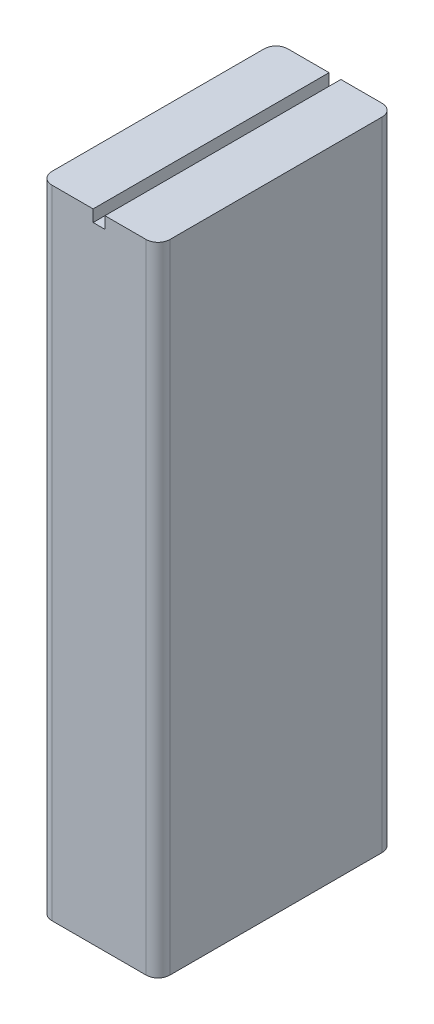
ISO-10303-21;
HEADER;
FILE_DESCRIPTION(('STEP AP214'),'2;1');
FILE_NAME('part.step','',(''),(''),'','','');
FILE_SCHEMA(('AUTOMOTIVE_DESIGN { 1 0 10303 214 1 1 1 1 }'));
ENDSEC;
DATA;
#1=APPLICATION_CONTEXT('core data for automotive mechanical design processes');
#2=APPLICATION_PROTOCOL_DEFINITION('international standard','automotive_design',2000,#1);
#3=PRODUCT_CONTEXT('',#1,'mechanical');
#4=PRODUCT('Part','Part','',(#3));
#5=PRODUCT_RELATED_PRODUCT_CATEGORY('part','',(#4));
#6=PRODUCT_DEFINITION_FORMATION('','',#4);
#7=PRODUCT_DEFINITION_CONTEXT('part definition',#1,'design');
#8=PRODUCT_DEFINITION('design','',#6,#7);
#9=PRODUCT_DEFINITION_SHAPE('','',#8);
#10=(LENGTH_UNIT() NAMED_UNIT(*) SI_UNIT(.MILLI.,.METRE.));
#11=(NAMED_UNIT(*) PLANE_ANGLE_UNIT() SI_UNIT($,.RADIAN.));
#12=(NAMED_UNIT(*) SI_UNIT($,.STERADIAN.) SOLID_ANGLE_UNIT());
#13=UNCERTAINTY_MEASURE_WITH_UNIT(LENGTH_MEASURE(1.E-05),#10,'distance_accuracy_value','');
#14=(GEOMETRIC_REPRESENTATION_CONTEXT(3) GLOBAL_UNCERTAINTY_ASSIGNED_CONTEXT((#13)) GLOBAL_UNIT_ASSIGNED_CONTEXT((#10,
#11,#12)) REPRESENTATION_CONTEXT('',''));
#15=CARTESIAN_POINT('',(0.,0.,0.));
#16=DIRECTION('',(0.,0.,1.));
#17=DIRECTION('',(1.,0.,0.));
#18=AXIS2_PLACEMENT_3D('',#15,#16,#17);
#19=CARTESIAN_POINT('',(0.,54.,0.));
#20=DIRECTION('',(0.,-1.,0.));
#21=DIRECTION('',(0.,0.,-1.));
#22=AXIS2_PLACEMENT_3D('',#19,#20,#21);
#23=PLANE('',#22);
#24=DIRECTION('',(1.,0.,0.));
#25=VECTOR('',#24,1.);
#26=CARTESIAN_POINT('',(0.,54.,0.));
#27=LINE('',#26,#25);
#28=CARTESIAN_POINT('',(0.999999999999999,54.,0.));
#29=VERTEX_POINT('',#28);
#30=CARTESIAN_POINT('',(4.5,54.,0.));
#31=VERTEX_POINT('',#30);
#32=EDGE_CURVE('E170',#29,#31,#27,.T.);
#33=ORIENTED_EDGE('',*,*,#32,.T.);
#34=DIRECTION('',(0.,0.,1.));
#35=VECTOR('',#34,1.);
#36=CARTESIAN_POINT('',(4.5,54.,-20.));
#37=LINE('',#36,#35);
#38=CARTESIAN_POINT('',(4.5,54.,-20.));
#39=VERTEX_POINT('',#38);
#40=EDGE_CURVE('E133',#39,#31,#37,.T.);
#41=ORIENTED_EDGE('',*,*,#40,.F.);
#42=DIRECTION('',(-1.,0.,0.));
#43=VECTOR('',#42,1.);
#44=CARTESIAN_POINT('',(0.,54.,-20.));
#45=LINE('',#44,#43);
#46=CARTESIAN_POINT('',(0.999999999999997,54.,-20.));
#47=VERTEX_POINT('',#46);
#48=EDGE_CURVE('E62',#39,#47,#45,.T.);
#49=ORIENTED_EDGE('',*,*,#48,.T.);
#50=CARTESIAN_POINT('',(0.999999999999997,54.,-19.));
#51=DIRECTION('',(0.,-1.,0.));
#52=DIRECTION('',(0.,0.,-1.));
#53=AXIS2_PLACEMENT_3D('',#50,#51,#52);
#54=CIRCLE('',#53,1.);
#55=CARTESIAN_POINT('',(0.,54.,-19.));
#56=VERTEX_POINT('',#55);
#57=EDGE_CURVE('E207',#47,#56,#54,.F.);
#58=ORIENTED_EDGE('',*,*,#57,.T.);
#59=DIRECTION('',(0.,0.,1.));
#60=VECTOR('',#59,1.);
#61=CARTESIAN_POINT('',(0.,54.,0.));
#62=LINE('',#61,#60);
#63=CARTESIAN_POINT('',(0.,54.,-1.));
#64=VERTEX_POINT('',#63);
#65=EDGE_CURVE('E165',#56,#64,#62,.T.);
#66=ORIENTED_EDGE('',*,*,#65,.T.);
#67=CARTESIAN_POINT('',(1.,54.,-1.));
#68=DIRECTION('',(0.,-1.,0.));
#69=DIRECTION('',(0.,0.,-1.));
#70=AXIS2_PLACEMENT_3D('',#67,#68,#69);
#71=CIRCLE('',#70,1.);
#72=EDGE_CURVE('E211',#64,#29,#71,.F.);
#73=ORIENTED_EDGE('',*,*,#72,.T.);
#74=EDGE_LOOP('',(#33,#41,#49,#58,#66,#73));
#75=FACE_BOUND('',#74,.T.);
#76=ADVANCED_FACE('F39',(#75),#23,.F.);
#77=CARTESIAN_POINT('',(0.,54.,0.));
#78=DIRECTION('',(1.,0.,0.));
#79=DIRECTION('',(0.,0.,-1.));
#80=AXIS2_PLACEMENT_3D('',#77,#78,#79);
#81=PLANE('',#80);
#82=DIRECTION('',(0.,0.,1.));
#83=VECTOR('',#82,1.);
#84=CARTESIAN_POINT('',(0.,0.,0.));
#85=LINE('',#84,#83);
#86=CARTESIAN_POINT('',(0.,0.,-19.));
#87=VERTEX_POINT('',#86);
#88=CARTESIAN_POINT('',(0.,0.,-1.));
#89=VERTEX_POINT('',#88);
#90=EDGE_CURVE('E160',#87,#89,#85,.T.);
#91=ORIENTED_EDGE('',*,*,#90,.T.);
#92=DIRECTION('',(0.,-1.,0.));
#93=VECTOR('',#92,1.);
#94=CARTESIAN_POINT('',(0.,54.,-1.));
#95=LINE('',#94,#93);
#96=EDGE_CURVE('E218',#89,#64,#95,.F.);
#97=ORIENTED_EDGE('',*,*,#96,.T.);
#98=ORIENTED_EDGE('',*,*,#65,.F.);
#99=DIRECTION('',(0.,-1.,0.));
#100=VECTOR('',#99,1.);
#101=CARTESIAN_POINT('',(0.,54.,-19.));
#102=LINE('',#101,#100);
#103=EDGE_CURVE('E215',#56,#87,#102,.T.);
#104=ORIENTED_EDGE('',*,*,#103,.T.);
#105=EDGE_LOOP('',(#91,#97,#98,#104));
#106=FACE_BOUND('',#105,.T.);
#107=ADVANCED_FACE('F229',(#106),#81,.F.);
#108=CARTESIAN_POINT('',(0.,54.,0.));
#109=DIRECTION('',(0.,0.,-1.));
#110=DIRECTION('',(-1.,0.,0.));
#111=AXIS2_PLACEMENT_3D('',#108,#109,#110);
#112=PLANE('',#111);
#113=DIRECTION('',(1.,0.,0.));
#114=VECTOR('',#113,1.);
#115=CARTESIAN_POINT('',(4.5,53.,0.));
#116=LINE('',#115,#114);
#117=CARTESIAN_POINT('',(4.5,53.,0.));
#118=VERTEX_POINT('',#117);
#119=CARTESIAN_POINT('',(5.5,53.,0.));
#120=VERTEX_POINT('',#119);
#121=EDGE_CURVE('E144',#118,#120,#116,.T.);
#122=ORIENTED_EDGE('',*,*,#121,.F.);
#123=DIRECTION('',(0.,1.,0.));
#124=VECTOR('',#123,1.);
#125=CARTESIAN_POINT('',(4.5,53.,0.));
#126=LINE('',#125,#124);
#127=EDGE_CURVE('E128',#118,#31,#126,.T.);
#128=ORIENTED_EDGE('',*,*,#127,.T.);
#129=ORIENTED_EDGE('',*,*,#32,.F.);
#130=DIRECTION('',(0.,-1.,0.));
#131=VECTOR('',#130,1.);
#132=CARTESIAN_POINT('',(1.,54.,0.));
#133=LINE('',#132,#131);
#134=CARTESIAN_POINT('',(0.999999999999999,0.,0.));
#135=VERTEX_POINT('',#134);
#136=EDGE_CURVE('E201',#29,#135,#133,.T.);
#137=ORIENTED_EDGE('',*,*,#136,.T.);
#138=DIRECTION('',(1.,0.,0.));
#139=VECTOR('',#138,1.);
#140=CARTESIAN_POINT('',(0.,0.,0.));
#141=LINE('',#140,#139);
#142=CARTESIAN_POINT('',(9.,0.,0.));
#143=VERTEX_POINT('',#142);
#144=EDGE_CURVE('E181',#135,#143,#141,.T.);
#145=ORIENTED_EDGE('',*,*,#144,.T.);
#146=DIRECTION('',(0.,-1.,0.));
#147=VECTOR('',#146,1.);
#148=CARTESIAN_POINT('',(9.00000000000001,54.,0.));
#149=LINE('',#148,#147);
#150=CARTESIAN_POINT('',(9.,54.,0.));
#151=VERTEX_POINT('',#150);
#152=EDGE_CURVE('E204',#143,#151,#149,.F.);
#153=ORIENTED_EDGE('',*,*,#152,.T.);
#154=CARTESIAN_POINT('',(5.5,54.,0.));
#155=VERTEX_POINT('',#154);
#156=EDGE_CURVE('E168',#155,#151,#27,.T.);
#157=ORIENTED_EDGE('',*,*,#156,.F.);
#158=DIRECTION('',(0.,1.,0.));
#159=VECTOR('',#158,1.);
#160=CARTESIAN_POINT('',(5.5,53.,0.));
#161=LINE('',#160,#159);
#162=EDGE_CURVE('E54',#120,#155,#161,.T.);
#163=ORIENTED_EDGE('',*,*,#162,.F.);
#164=EDGE_LOOP('',(#122,#128,#129,#137,#145,#153,#157,#163));
#165=FACE_BOUND('',#164,.T.);
#166=ADVANCED_FACE('F149',(#165),#112,.F.);
#167=CARTESIAN_POINT('',(10.,54.,0.));
#168=DIRECTION('',(-1.,0.,0.));
#169=DIRECTION('',(0.,0.,1.));
#170=AXIS2_PLACEMENT_3D('',#167,#168,#169);
#171=PLANE('',#170);
#172=DIRECTION('',(0.,0.,-1.));
#173=VECTOR('',#172,1.);
#174=CARTESIAN_POINT('',(10.,54.,0.));
#175=LINE('',#174,#173);
#176=CARTESIAN_POINT('',(10.,54.,-1.));
#177=VERTEX_POINT('',#176);
#178=CARTESIAN_POINT('',(10.,54.,-19.));
#179=VERTEX_POINT('',#178);
#180=EDGE_CURVE('E172',#177,#179,#175,.T.);
#181=ORIENTED_EDGE('',*,*,#180,.F.);
#182=DIRECTION('',(0.,-1.,0.));
#183=VECTOR('',#182,1.);
#184=CARTESIAN_POINT('',(10.,54.,-1.));
#185=LINE('',#184,#183);
#186=CARTESIAN_POINT('',(10.,0.,-1.));
#187=VERTEX_POINT('',#186);
#188=EDGE_CURVE('E190',#177,#187,#185,.T.);
#189=ORIENTED_EDGE('',*,*,#188,.T.);
#190=DIRECTION('',(0.,0.,-1.));
#191=VECTOR('',#190,1.);
#192=CARTESIAN_POINT('',(10.,0.,0.));
#193=LINE('',#192,#191);
#194=CARTESIAN_POINT('',(10.,0.,-19.));
#195=VERTEX_POINT('',#194);
#196=EDGE_CURVE('E184',#187,#195,#193,.T.);
#197=ORIENTED_EDGE('',*,*,#196,.T.);
#198=DIRECTION('',(0.,-1.,0.));
#199=VECTOR('',#198,1.);
#200=CARTESIAN_POINT('',(10.,54.,-19.));
#201=LINE('',#200,#199);
#202=EDGE_CURVE('E178',#195,#179,#201,.F.);
#203=ORIENTED_EDGE('',*,*,#202,.T.);
#204=EDGE_LOOP('',(#181,#189,#197,#203));
#205=FACE_BOUND('',#204,.T.);
#206=ADVANCED_FACE('F246',(#205),#171,.F.);
#207=CARTESIAN_POINT('',(0.,54.,-20.));
#208=DIRECTION('',(0.,0.,1.));
#209=DIRECTION('',(1.,0.,0.));
#210=AXIS2_PLACEMENT_3D('',#207,#208,#209);
#211=PLANE('',#210);
#212=ORIENTED_EDGE('',*,*,#48,.F.);
#213=DIRECTION('',(0.,1.,0.));
#214=VECTOR('',#213,1.);
#215=CARTESIAN_POINT('',(4.5,53.,-20.));
#216=LINE('',#215,#214);
#217=CARTESIAN_POINT('',(4.5,53.,-20.));
#218=VERTEX_POINT('',#217);
#219=EDGE_CURVE('E158',#218,#39,#216,.T.);
#220=ORIENTED_EDGE('',*,*,#219,.F.);
#221=DIRECTION('',(-1.,0.,0.));
#222=VECTOR('',#221,1.);
#223=CARTESIAN_POINT('',(4.5,53.,-20.));
#224=LINE('',#223,#222);
#225=CARTESIAN_POINT('',(5.5,53.,-20.));
#226=VERTEX_POINT('',#225);
#227=EDGE_CURVE('E138',#226,#218,#224,.T.);
#228=ORIENTED_EDGE('',*,*,#227,.F.);
#229=DIRECTION('',(0.,1.,0.));
#230=VECTOR('',#229,1.);
#231=CARTESIAN_POINT('',(5.5,53.,-20.));
#232=LINE('',#231,#230);
#233=CARTESIAN_POINT('',(5.5,54.,-20.));
#234=VERTEX_POINT('',#233);
#235=EDGE_CURVE('E161',#226,#234,#232,.T.);
#236=ORIENTED_EDGE('',*,*,#235,.T.);
#237=CARTESIAN_POINT('',(9.,54.,-20.));
#238=VERTEX_POINT('',#237);
#239=EDGE_CURVE('E175',#238,#234,#45,.T.);
#240=ORIENTED_EDGE('',*,*,#239,.F.);
#241=DIRECTION('',(0.,-1.,0.));
#242=VECTOR('',#241,1.);
#243=CARTESIAN_POINT('',(9.,54.,-20.));
#244=LINE('',#243,#242);
#245=CARTESIAN_POINT('',(9.,0.,-20.));
#246=VERTEX_POINT('',#245);
#247=EDGE_CURVE('E11',#238,#246,#244,.T.);
#248=ORIENTED_EDGE('',*,*,#247,.T.);
#249=DIRECTION('',(-1.,0.,0.));
#250=VECTOR('',#249,1.);
#251=CARTESIAN_POINT('',(0.,0.,-20.));
#252=LINE('',#251,#250);
#253=CARTESIAN_POINT('',(0.999999999999997,0.,-20.));
#254=VERTEX_POINT('',#253);
#255=EDGE_CURVE('E169',#246,#254,#252,.T.);
#256=ORIENTED_EDGE('',*,*,#255,.T.);
#257=DIRECTION('',(0.,-1.,0.));
#258=VECTOR('',#257,1.);
#259=CARTESIAN_POINT('',(0.999999999999997,54.,-20.));
#260=LINE('',#259,#258);
#261=EDGE_CURVE('E47',#254,#47,#260,.F.);
#262=ORIENTED_EDGE('',*,*,#261,.T.);
#263=EDGE_LOOP('',(#212,#220,#228,#236,#240,#248,#256,#262));
#264=FACE_BOUND('',#263,.T.);
#265=ADVANCED_FACE('F222',(#264),#211,.F.);
#266=ORIENTED_EDGE('',*,*,#239,.T.);
#267=DIRECTION('',(0.,0.,-1.));
#268=VECTOR('',#267,1.);
#269=CARTESIAN_POINT('',(5.5,54.,-20.));
#270=LINE('',#269,#268);
#271=EDGE_CURVE('E147',#155,#234,#270,.T.);
#272=ORIENTED_EDGE('',*,*,#271,.F.);
#273=ORIENTED_EDGE('',*,*,#156,.T.);
#274=CARTESIAN_POINT('',(9.00000000000001,54.,-1.));
#275=DIRECTION('',(0.,-1.,0.));
#276=DIRECTION('',(0.,0.,-1.));
#277=AXIS2_PLACEMENT_3D('',#274,#275,#276);
#278=CIRCLE('',#277,1.);
#279=EDGE_CURVE('E213',#151,#177,#278,.F.);
#280=ORIENTED_EDGE('',*,*,#279,.T.);
#281=ORIENTED_EDGE('',*,*,#180,.T.);
#282=CARTESIAN_POINT('',(9.,54.,-19.));
#283=DIRECTION('',(0.,-1.,0.));
#284=DIRECTION('',(0.,0.,-1.));
#285=AXIS2_PLACEMENT_3D('',#282,#283,#284);
#286=CIRCLE('',#285,1.);
#287=EDGE_CURVE('E209',#179,#238,#286,.F.);
#288=ORIENTED_EDGE('',*,*,#287,.T.);
#289=EDGE_LOOP('',(#266,#272,#273,#280,#281,#288));
#290=FACE_BOUND('',#289,.T.);
#291=ADVANCED_FACE('F250',(#290),#23,.F.);
#292=CARTESIAN_POINT('',(0.,0.,0.));
#293=DIRECTION('',(0.,-1.,0.));
#294=DIRECTION('',(0.,0.,-1.));
#295=AXIS2_PLACEMENT_3D('',#292,#293,#294);
#296=PLANE('',#295);
#297=ORIENTED_EDGE('',*,*,#196,.F.);
#298=CARTESIAN_POINT('',(9.00000000000001,0.,-1.));
#299=DIRECTION('',(0.,-1.,0.));
#300=DIRECTION('',(0.,0.,-1.));
#301=AXIS2_PLACEMENT_3D('',#298,#299,#300);
#302=CIRCLE('',#301,1.);
#303=EDGE_CURVE('E199',#187,#143,#302,.T.);
#304=ORIENTED_EDGE('',*,*,#303,.T.);
#305=ORIENTED_EDGE('',*,*,#144,.F.);
#306=CARTESIAN_POINT('',(1.,0.,-1.));
#307=DIRECTION('',(0.,-1.,0.));
#308=DIRECTION('',(0.,0.,-1.));
#309=AXIS2_PLACEMENT_3D('',#306,#307,#308);
#310=CIRCLE('',#309,1.);
#311=EDGE_CURVE('E197',#135,#89,#310,.T.);
#312=ORIENTED_EDGE('',*,*,#311,.T.);
#313=ORIENTED_EDGE('',*,*,#90,.F.);
#314=CARTESIAN_POINT('',(0.999999999999997,0.,-19.));
#315=DIRECTION('',(0.,-1.,0.));
#316=DIRECTION('',(0.,0.,-1.));
#317=AXIS2_PLACEMENT_3D('',#314,#315,#316);
#318=CIRCLE('',#317,1.);
#319=EDGE_CURVE('E193',#87,#254,#318,.T.);
#320=ORIENTED_EDGE('',*,*,#319,.T.);
#321=ORIENTED_EDGE('',*,*,#255,.F.);
#322=CARTESIAN_POINT('',(9.,0.,-19.));
#323=DIRECTION('',(0.,-1.,0.));
#324=DIRECTION('',(0.,0.,-1.));
#325=AXIS2_PLACEMENT_3D('',#322,#323,#324);
#326=CIRCLE('',#325,1.);
#327=EDGE_CURVE('E195',#246,#195,#326,.T.);
#328=ORIENTED_EDGE('',*,*,#327,.T.);
#329=EDGE_LOOP('',(#297,#304,#305,#312,#313,#320,#321,#328));
#330=FACE_BOUND('',#329,.T.);
#331=ADVANCED_FACE('F239',(#330),#296,.T.);
#332=CARTESIAN_POINT('',(9.00000000000001,54.,-1.));
#333=DIRECTION('',(0.,-1.,0.));
#334=DIRECTION('',(0.,0.,-1.));
#335=AXIS2_PLACEMENT_3D('',#332,#333,#334);
#336=CYLINDRICAL_SURFACE('',#335,1.);
#337=ORIENTED_EDGE('',*,*,#279,.F.);
#338=ORIENTED_EDGE('',*,*,#152,.F.);
#339=ORIENTED_EDGE('',*,*,#303,.F.);
#340=ORIENTED_EDGE('',*,*,#188,.F.);
#341=EDGE_LOOP('',(#337,#338,#339,#340));
#342=FACE_BOUND('',#341,.T.);
#343=ADVANCED_FACE('F243',(#342),#336,.T.);
#344=CARTESIAN_POINT('',(1.,54.,-1.));
#345=DIRECTION('',(0.,-1.,0.));
#346=DIRECTION('',(0.,0.,-1.));
#347=AXIS2_PLACEMENT_3D('',#344,#345,#346);
#348=CYLINDRICAL_SURFACE('',#347,1.);
#349=ORIENTED_EDGE('',*,*,#72,.F.);
#350=ORIENTED_EDGE('',*,*,#96,.F.);
#351=ORIENTED_EDGE('',*,*,#311,.F.);
#352=ORIENTED_EDGE('',*,*,#136,.F.);
#353=EDGE_LOOP('',(#349,#350,#351,#352));
#354=FACE_BOUND('',#353,.T.);
#355=ADVANCED_FACE('F233',(#354),#348,.T.);
#356=CARTESIAN_POINT('',(9.,54.,-19.));
#357=DIRECTION('',(0.,-1.,0.));
#358=DIRECTION('',(0.,0.,-1.));
#359=AXIS2_PLACEMENT_3D('',#356,#357,#358);
#360=CYLINDRICAL_SURFACE('',#359,1.);
#361=ORIENTED_EDGE('',*,*,#287,.F.);
#362=ORIENTED_EDGE('',*,*,#202,.F.);
#363=ORIENTED_EDGE('',*,*,#327,.F.);
#364=ORIENTED_EDGE('',*,*,#247,.F.);
#365=EDGE_LOOP('',(#361,#362,#363,#364));
#366=FACE_BOUND('',#365,.T.);
#367=ADVANCED_FACE('F254',(#366),#360,.T.);
#368=CARTESIAN_POINT('',(0.999999999999997,54.,-19.));
#369=DIRECTION('',(0.,-1.,0.));
#370=DIRECTION('',(0.,0.,-1.));
#371=AXIS2_PLACEMENT_3D('',#368,#369,#370);
#372=CYLINDRICAL_SURFACE('',#371,1.);
#373=ORIENTED_EDGE('',*,*,#57,.F.);
#374=ORIENTED_EDGE('',*,*,#261,.F.);
#375=ORIENTED_EDGE('',*,*,#319,.F.);
#376=ORIENTED_EDGE('',*,*,#103,.F.);
#377=EDGE_LOOP('',(#373,#374,#375,#376));
#378=FACE_BOUND('',#377,.T.);
#379=ADVANCED_FACE('F41',(#378),#372,.T.);
#380=CARTESIAN_POINT('',(4.5,53.,-20.));
#381=DIRECTION('',(-1.,0.,0.));
#382=DIRECTION('',(0.,0.,1.));
#383=AXIS2_PLACEMENT_3D('',#380,#381,#382);
#384=PLANE('',#383);
#385=ORIENTED_EDGE('',*,*,#40,.T.);
#386=ORIENTED_EDGE('',*,*,#127,.F.);
#387=DIRECTION('',(0.,0.,1.));
#388=VECTOR('',#387,1.);
#389=CARTESIAN_POINT('',(4.5,53.,-20.));
#390=LINE('',#389,#388);
#391=EDGE_CURVE('E131',#218,#118,#390,.T.);
#392=ORIENTED_EDGE('',*,*,#391,.F.);
#393=ORIENTED_EDGE('',*,*,#219,.T.);
#394=EDGE_LOOP('',(#385,#386,#392,#393));
#395=FACE_BOUND('',#394,.T.);
#396=ADVANCED_FACE('F130',(#395),#384,.F.);
#397=CARTESIAN_POINT('',(5.5,53.,-20.));
#398=DIRECTION('',(1.,0.,0.));
#399=DIRECTION('',(0.,0.,-1.));
#400=AXIS2_PLACEMENT_3D('',#397,#398,#399);
#401=PLANE('',#400);
#402=ORIENTED_EDGE('',*,*,#271,.T.);
#403=ORIENTED_EDGE('',*,*,#235,.F.);
#404=DIRECTION('',(0.,0.,-1.));
#405=VECTOR('',#404,1.);
#406=CARTESIAN_POINT('',(5.5,53.,-20.));
#407=LINE('',#406,#405);
#408=EDGE_CURVE('E151',#120,#226,#407,.T.);
#409=ORIENTED_EDGE('',*,*,#408,.F.);
#410=ORIENTED_EDGE('',*,*,#162,.T.);
#411=EDGE_LOOP('',(#402,#403,#409,#410));
#412=FACE_BOUND('',#411,.T.);
#413=ADVANCED_FACE('F255',(#412),#401,.F.);
#414=CARTESIAN_POINT('',(0.,53.,0.));
#415=DIRECTION('',(0.,1.,0.));
#416=DIRECTION('',(0.,0.,1.));
#417=AXIS2_PLACEMENT_3D('',#414,#415,#416);
#418=PLANE('',#417);
#419=ORIENTED_EDGE('',*,*,#391,.T.);
#420=ORIENTED_EDGE('',*,*,#121,.T.);
#421=ORIENTED_EDGE('',*,*,#408,.T.);
#422=ORIENTED_EDGE('',*,*,#227,.T.);
#423=EDGE_LOOP('',(#419,#420,#421,#422));
#424=FACE_BOUND('',#423,.T.);
#425=ADVANCED_FACE('F142',(#424),#418,.T.);
#426=CLOSED_SHELL('',(#76,#107,#166,#206,#265,#291,#331,#343,#355,#367,#379,#396,#413,#425));
#427=MANIFOLD_SOLID_BREP('B2',#426);
#428=ADVANCED_BREP_SHAPE_REPRESENTATION('',(#18,#427),#14);
#429=SHAPE_DEFINITION_REPRESENTATION(#9,#428);
ENDSEC;
END-ISO-10303-21;
